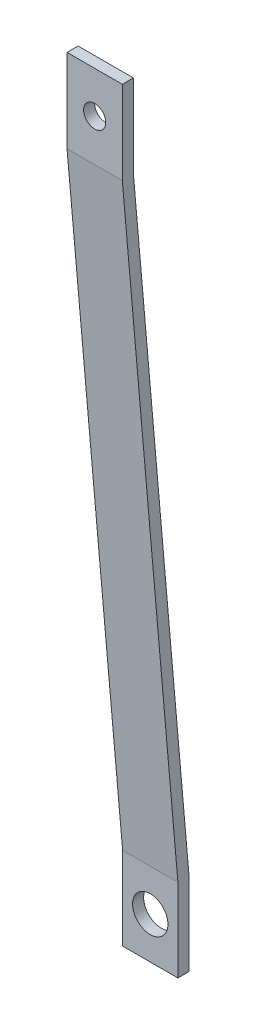
ISO-10303-21;
HEADER;
FILE_DESCRIPTION(('STEP AP214'),'2;1');
FILE_NAME('part.step','',(''),(''),'','','');
FILE_SCHEMA(('AUTOMOTIVE_DESIGN { 1 0 10303 214 1 1 1 1 }'));
ENDSEC;
DATA;
#1=APPLICATION_CONTEXT('core data for automotive mechanical design processes');
#2=APPLICATION_PROTOCOL_DEFINITION('international standard','automotive_design',2000,#1);
#3=PRODUCT_CONTEXT('',#1,'mechanical');
#4=PRODUCT('Part','Part','',(#3));
#5=PRODUCT_RELATED_PRODUCT_CATEGORY('part','',(#4));
#6=PRODUCT_DEFINITION_FORMATION('','',#4);
#7=PRODUCT_DEFINITION_CONTEXT('part definition',#1,'design');
#8=PRODUCT_DEFINITION('design','',#6,#7);
#9=PRODUCT_DEFINITION_SHAPE('','',#8);
#10=(LENGTH_UNIT() NAMED_UNIT(*) SI_UNIT(.MILLI.,.METRE.));
#11=(NAMED_UNIT(*) PLANE_ANGLE_UNIT() SI_UNIT($,.RADIAN.));
#12=(NAMED_UNIT(*) SI_UNIT($,.STERADIAN.) SOLID_ANGLE_UNIT());
#13=UNCERTAINTY_MEASURE_WITH_UNIT(LENGTH_MEASURE(1.E-05),#10,'distance_accuracy_value','');
#14=(GEOMETRIC_REPRESENTATION_CONTEXT(3) GLOBAL_UNCERTAINTY_ASSIGNED_CONTEXT((#13)) GLOBAL_UNIT_ASSIGNED_CONTEXT((#10,
#11,#12)) REPRESENTATION_CONTEXT('',''));
#15=CARTESIAN_POINT('',(0.,0.,0.));
#16=DIRECTION('',(0.,0.,1.));
#17=DIRECTION('',(1.,0.,0.));
#18=AXIS2_PLACEMENT_3D('',#15,#16,#17);
#19=CARTESIAN_POINT('',(10.,0.,2.));
#20=DIRECTION('',(0.,1.,0.));
#21=DIRECTION('',(0.,0.,1.));
#22=AXIS2_PLACEMENT_3D('',#19,#20,#21);
#23=PLANE('',#22);
#24=DIRECTION('',(0.,0.,-1.));
#25=VECTOR('',#24,1.);
#26=CARTESIAN_POINT('',(0.,0.,2.));
#27=LINE('',#26,#25);
#28=CARTESIAN_POINT('',(0.,0.,2.));
#29=VERTEX_POINT('',#28);
#30=CARTESIAN_POINT('',(0.,0.,0.));
#31=VERTEX_POINT('',#30);
#32=EDGE_CURVE('E132',#29,#31,#27,.T.);
#33=ORIENTED_EDGE('',*,*,#32,.T.);
#34=DIRECTION('',(-1.,0.,0.));
#35=VECTOR('',#34,1.);
#36=CARTESIAN_POINT('',(10.,0.,0.));
#37=LINE('',#36,#35);
#38=CARTESIAN_POINT('',(10.,0.,0.));
#39=VERTEX_POINT('',#38);
#40=EDGE_CURVE('E11',#39,#31,#37,.T.);
#41=ORIENTED_EDGE('',*,*,#40,.F.);
#42=DIRECTION('',(0.,0.,-1.));
#43=VECTOR('',#42,1.);
#44=CARTESIAN_POINT('',(10.,0.,2.));
#45=LINE('',#44,#43);
#46=CARTESIAN_POINT('',(10.,0.,2.));
#47=VERTEX_POINT('',#46);
#48=EDGE_CURVE('E147',#47,#39,#45,.T.);
#49=ORIENTED_EDGE('',*,*,#48,.F.);
#50=DIRECTION('',(-1.,0.,0.));
#51=VECTOR('',#50,1.);
#52=CARTESIAN_POINT('',(10.,0.,2.));
#53=LINE('',#52,#51);
#54=EDGE_CURVE('E128',#47,#29,#53,.T.);
#55=ORIENTED_EDGE('',*,*,#54,.T.);
#56=EDGE_LOOP('',(#33,#41,#49,#55));
#57=FACE_BOUND('',#56,.T.);
#58=ADVANCED_FACE('F36',(#57),#23,.F.);
#59=CARTESIAN_POINT('',(10.,15.087321885817,0.));
#60=DIRECTION('',(0.,0.,1.));
#61=DIRECTION('',(0.,-1.,0.));
#62=AXIS2_PLACEMENT_3D('',#59,#60,#61);
#63=PLANE('',#62);
#64=CARTESIAN_POINT('',(5.,7.5,0.));
#65=DIRECTION('',(0.,0.,1.));
#66=DIRECTION('',(0.,-1.,0.));
#67=AXIS2_PLACEMENT_3D('',#64,#65,#66);
#68=CIRCLE('',#67,3.2);
#69=CARTESIAN_POINT('',(5.,4.3,0.));
#70=VERTEX_POINT('',#69);
#71=EDGE_CURVE('E136',#70,#70,#68,.F.);
#72=ORIENTED_EDGE('',*,*,#71,.F.);
#73=EDGE_LOOP('',(#72));
#74=FACE_BOUND('',#73,.T.);
#75=DIRECTION('',(0.,1.,0.));
#76=VECTOR('',#75,1.);
#77=CARTESIAN_POINT('',(0.,15.087321885817,0.));
#78=LINE('',#77,#76);
#79=CARTESIAN_POINT('',(0.,15.087321885817,0.));
#80=VERTEX_POINT('',#79);
#81=EDGE_CURVE('E135',#31,#80,#78,.T.);
#82=ORIENTED_EDGE('',*,*,#81,.T.);
#83=DIRECTION('',(-1.,0.,0.));
#84=VECTOR('',#83,1.);
#85=CARTESIAN_POINT('',(10.,15.087321885817,0.));
#86=LINE('',#85,#84);
#87=CARTESIAN_POINT('',(10.,15.087321885817,0.));
#88=VERTEX_POINT('',#87);
#89=EDGE_CURVE('E44',#88,#80,#86,.T.);
#90=ORIENTED_EDGE('',*,*,#89,.F.);
#91=DIRECTION('',(0.,1.,0.));
#92=VECTOR('',#91,1.);
#93=CARTESIAN_POINT('',(10.,15.087321885817,0.));
#94=LINE('',#93,#92);
#95=EDGE_CURVE('E95',#39,#88,#94,.T.);
#96=ORIENTED_EDGE('',*,*,#95,.F.);
#97=ORIENTED_EDGE('',*,*,#40,.T.);
#98=EDGE_LOOP('',(#82,#90,#96,#97));
#99=FACE_BOUND('',#98,.T.);
#100=ADVANCED_FACE('F204',(#74,#99),#63,.F.);
#101=CARTESIAN_POINT('',(10.,130.,10.0535566303938));
#102=DIRECTION('',(0.,-0.0871557427476515,0.996194698091746));
#103=DIRECTION('',(0.,-0.996194698091746,-0.0871557427476515));
#104=AXIS2_PLACEMENT_3D('',#101,#102,#103);
#105=PLANE('',#104);
#106=DIRECTION('',(0.,0.996194698091746,0.0871557427476515));
#107=VECTOR('',#106,1.);
#108=CARTESIAN_POINT('',(0.,130.,10.0535566303938));
#109=LINE('',#108,#107);
#110=CARTESIAN_POINT('',(0.,130.,10.0535566303938));
#111=VERTEX_POINT('',#110);
#112=EDGE_CURVE('E138',#80,#111,#109,.T.);
#113=ORIENTED_EDGE('',*,*,#112,.T.);
#114=DIRECTION('',(-1.,0.,0.));
#115=VECTOR('',#114,1.);
#116=CARTESIAN_POINT('',(10.,130.,10.0535566303938));
#117=LINE('',#116,#115);
#118=CARTESIAN_POINT('',(10.,130.,10.0535566303938));
#119=VERTEX_POINT('',#118);
#120=EDGE_CURVE('E154',#119,#111,#117,.T.);
#121=ORIENTED_EDGE('',*,*,#120,.F.);
#122=DIRECTION('',(0.,0.996194698091746,0.0871557427476515));
#123=VECTOR('',#122,1.);
#124=CARTESIAN_POINT('',(10.,130.,10.0535566303938));
#125=LINE('',#124,#123);
#126=EDGE_CURVE('E162',#88,#119,#125,.T.);
#127=ORIENTED_EDGE('',*,*,#126,.F.);
#128=ORIENTED_EDGE('',*,*,#89,.T.);
#129=EDGE_LOOP('',(#113,#121,#127,#128));
#130=FACE_BOUND('',#129,.T.);
#131=ADVANCED_FACE('F160',(#130),#105,.F.);
#132=CARTESIAN_POINT('',(10.,145.,10.0535566303938));
#133=DIRECTION('',(0.,0.,1.));
#134=DIRECTION('',(1.,0.,0.));
#135=AXIS2_PLACEMENT_3D('',#132,#133,#134);
#136=PLANE('',#135);
#137=CARTESIAN_POINT('',(5.,137.5,10.0535566303938));
#138=DIRECTION('',(0.,0.,1.));
#139=DIRECTION('',(1.,0.,0.));
#140=AXIS2_PLACEMENT_3D('',#137,#138,#139);
#141=CIRCLE('',#140,2.);
#142=CARTESIAN_POINT('',(7.,137.5,10.0535566303938));
#143=VERTEX_POINT('',#142);
#144=EDGE_CURVE('E185',#143,#143,#141,.F.);
#145=ORIENTED_EDGE('',*,*,#144,.F.);
#146=EDGE_LOOP('',(#145));
#147=FACE_BOUND('',#146,.T.);
#148=DIRECTION('',(0.,1.,0.));
#149=VECTOR('',#148,1.);
#150=CARTESIAN_POINT('',(0.,145.,10.0535566303938));
#151=LINE('',#150,#149);
#152=CARTESIAN_POINT('',(0.,145.,10.0535566303938));
#153=VERTEX_POINT('',#152);
#154=EDGE_CURVE('E140',#111,#153,#151,.T.);
#155=ORIENTED_EDGE('',*,*,#154,.T.);
#156=DIRECTION('',(-1.,0.,0.));
#157=VECTOR('',#156,1.);
#158=CARTESIAN_POINT('',(10.,145.,10.0535566303938));
#159=LINE('',#158,#157);
#160=CARTESIAN_POINT('',(10.,145.,10.0535566303938));
#161=VERTEX_POINT('',#160);
#162=EDGE_CURVE('E151',#161,#153,#159,.T.);
#163=ORIENTED_EDGE('',*,*,#162,.F.);
#164=DIRECTION('',(0.,1.,0.));
#165=VECTOR('',#164,1.);
#166=CARTESIAN_POINT('',(10.,145.,10.0535566303938));
#167=LINE('',#166,#165);
#168=EDGE_CURVE('E174',#119,#161,#167,.T.);
#169=ORIENTED_EDGE('',*,*,#168,.F.);
#170=ORIENTED_EDGE('',*,*,#120,.T.);
#171=EDGE_LOOP('',(#155,#163,#169,#170));
#172=FACE_BOUND('',#171,.T.);
#173=ADVANCED_FACE('F170',(#147,#172),#136,.F.);
#174=CARTESIAN_POINT('',(10.,145.,12.0535566303938));
#175=DIRECTION('',(0.,-1.,0.));
#176=DIRECTION('',(0.,0.,-1.));
#177=AXIS2_PLACEMENT_3D('',#174,#175,#176);
#178=PLANE('',#177);
#179=DIRECTION('',(0.,0.,1.));
#180=VECTOR('',#179,1.);
#181=CARTESIAN_POINT('',(0.,145.,12.0535566303938));
#182=LINE('',#181,#180);
#183=CARTESIAN_POINT('',(0.,145.,12.0535566303938));
#184=VERTEX_POINT('',#183);
#185=EDGE_CURVE('E142',#153,#184,#182,.T.);
#186=ORIENTED_EDGE('',*,*,#185,.T.);
#187=DIRECTION('',(-1.,0.,0.));
#188=VECTOR('',#187,1.);
#189=CARTESIAN_POINT('',(10.,145.,12.0535566303938));
#190=LINE('',#189,#188);
#191=CARTESIAN_POINT('',(10.,145.,12.0535566303938));
#192=VERTEX_POINT('',#191);
#193=EDGE_CURVE('E123',#192,#184,#190,.T.);
#194=ORIENTED_EDGE('',*,*,#193,.F.);
#195=DIRECTION('',(0.,0.,1.));
#196=VECTOR('',#195,1.);
#197=CARTESIAN_POINT('',(10.,145.,12.0535566303938));
#198=LINE('',#197,#196);
#199=EDGE_CURVE('E114',#161,#192,#198,.T.);
#200=ORIENTED_EDGE('',*,*,#199,.F.);
#201=ORIENTED_EDGE('',*,*,#162,.T.);
#202=EDGE_LOOP('',(#186,#194,#200,#201));
#203=FACE_BOUND('',#202,.T.);
#204=ADVANCED_FACE('F173',(#203),#178,.F.);
#205=CARTESIAN_POINT('',(10.,145.,12.0535566303938));
#206=DIRECTION('',(0.,0.,-1.));
#207=DIRECTION('',(0.,1.,0.));
#208=AXIS2_PLACEMENT_3D('',#205,#206,#207);
#209=PLANE('',#208);
#210=CARTESIAN_POINT('',(5.,137.5,12.0535566303938));
#211=DIRECTION('',(0.,0.,1.));
#212=DIRECTION('',(1.,0.,0.));
#213=AXIS2_PLACEMENT_3D('',#210,#211,#212);
#214=CIRCLE('',#213,2.);
#215=CARTESIAN_POINT('',(7.,137.5,12.0535566303938));
#216=VERTEX_POINT('',#215);
#217=EDGE_CURVE('E188',#216,#216,#214,.T.);
#218=ORIENTED_EDGE('',*,*,#217,.F.);
#219=EDGE_LOOP('',(#218));
#220=FACE_BOUND('',#219,.T.);
#221=DIRECTION('',(0.,-1.,0.));
#222=VECTOR('',#221,1.);
#223=CARTESIAN_POINT('',(0.,145.,12.0535566303938));
#224=LINE('',#223,#222);
#225=CARTESIAN_POINT('',(0.,129.912678114183,12.0535566303938));
#226=VERTEX_POINT('',#225);
#227=EDGE_CURVE('E122',#184,#226,#224,.T.);
#228=ORIENTED_EDGE('',*,*,#227,.T.);
#229=DIRECTION('',(-1.,0.,0.));
#230=VECTOR('',#229,1.);
#231=CARTESIAN_POINT('',(10.,129.912678114183,12.0535566303938));
#232=LINE('',#231,#230);
#233=CARTESIAN_POINT('',(10.,129.912678114183,12.0535566303938));
#234=VERTEX_POINT('',#233);
#235=EDGE_CURVE('E119',#234,#226,#232,.T.);
#236=ORIENTED_EDGE('',*,*,#235,.F.);
#237=DIRECTION('',(0.,-1.,0.));
#238=VECTOR('',#237,1.);
#239=CARTESIAN_POINT('',(10.,145.,12.0535566303938));
#240=LINE('',#239,#238);
#241=EDGE_CURVE('E108',#192,#234,#240,.T.);
#242=ORIENTED_EDGE('',*,*,#241,.F.);
#243=ORIENTED_EDGE('',*,*,#193,.T.);
#244=EDGE_LOOP('',(#228,#236,#242,#243));
#245=FACE_BOUND('',#244,.T.);
#246=ADVANCED_FACE('F120',(#220,#245),#209,.F.);
#247=CARTESIAN_POINT('',(10.,129.912678114183,12.0535566303938));
#248=DIRECTION('',(0.,0.0871557427476515,-0.996194698091746));
#249=DIRECTION('',(0.,0.996194698091746,0.0871557427476515));
#250=AXIS2_PLACEMENT_3D('',#247,#248,#249);
#251=PLANE('',#250);
#252=DIRECTION('',(0.,-0.996194698091746,-0.0871557427476515));
#253=VECTOR('',#252,1.);
#254=CARTESIAN_POINT('',(0.,129.912678114183,12.0535566303938));
#255=LINE('',#254,#253);
#256=CARTESIAN_POINT('',(0.,15.,2.));
#257=VERTEX_POINT('',#256);
#258=EDGE_CURVE('E81',#226,#257,#255,.T.);
#259=ORIENTED_EDGE('',*,*,#258,.T.);
#260=DIRECTION('',(-1.,0.,0.));
#261=VECTOR('',#260,1.);
#262=CARTESIAN_POINT('',(10.,15.,2.));
#263=LINE('',#262,#261);
#264=CARTESIAN_POINT('',(10.,15.,2.));
#265=VERTEX_POINT('',#264);
#266=EDGE_CURVE('E124',#265,#257,#263,.T.);
#267=ORIENTED_EDGE('',*,*,#266,.F.);
#268=DIRECTION('',(0.,-0.996194698091746,-0.0871557427476515));
#269=VECTOR('',#268,1.);
#270=CARTESIAN_POINT('',(10.,129.912678114183,12.0535566303938));
#271=LINE('',#270,#269);
#272=EDGE_CURVE('E112',#234,#265,#271,.T.);
#273=ORIENTED_EDGE('',*,*,#272,.F.);
#274=ORIENTED_EDGE('',*,*,#235,.T.);
#275=EDGE_LOOP('',(#259,#267,#273,#274));
#276=FACE_BOUND('',#275,.T.);
#277=ADVANCED_FACE('F126',(#276),#251,.F.);
#278=CARTESIAN_POINT('',(10.,15.,2.));
#279=DIRECTION('',(0.,0.,-1.));
#280=DIRECTION('',(0.,1.,0.));
#281=AXIS2_PLACEMENT_3D('',#278,#279,#280);
#282=PLANE('',#281);
#283=CARTESIAN_POINT('',(5.,7.5,2.));
#284=DIRECTION('',(0.,0.,1.));
#285=DIRECTION('',(1.,0.,0.));
#286=AXIS2_PLACEMENT_3D('',#283,#284,#285);
#287=CIRCLE('',#286,3.2);
#288=CARTESIAN_POINT('',(8.2,7.5,2.));
#289=VERTEX_POINT('',#288);
#290=EDGE_CURVE('E182',#289,#289,#287,.T.);
#291=ORIENTED_EDGE('',*,*,#290,.F.);
#292=EDGE_LOOP('',(#291));
#293=FACE_BOUND('',#292,.T.);
#294=DIRECTION('',(0.,-1.,0.));
#295=VECTOR('',#294,1.);
#296=CARTESIAN_POINT('',(0.,15.,2.));
#297=LINE('',#296,#295);
#298=EDGE_CURVE('E87',#257,#29,#297,.T.);
#299=ORIENTED_EDGE('',*,*,#298,.T.);
#300=ORIENTED_EDGE('',*,*,#54,.F.);
#301=DIRECTION('',(0.,-1.,0.));
#302=VECTOR('',#301,1.);
#303=CARTESIAN_POINT('',(10.,15.,2.));
#304=LINE('',#303,#302);
#305=EDGE_CURVE('E52',#265,#47,#304,.T.);
#306=ORIENTED_EDGE('',*,*,#305,.F.);
#307=ORIENTED_EDGE('',*,*,#266,.T.);
#308=EDGE_LOOP('',(#299,#300,#306,#307));
#309=FACE_BOUND('',#308,.T.);
#310=ADVANCED_FACE('F200',(#293,#309),#282,.F.);
#311=CARTESIAN_POINT('',(10.,0.,0.));
#312=DIRECTION('',(-1.,0.,0.));
#313=DIRECTION('',(0.,0.,1.));
#314=AXIS2_PLACEMENT_3D('',#311,#312,#313);
#315=PLANE('',#314);
#316=ORIENTED_EDGE('',*,*,#48,.T.);
#317=ORIENTED_EDGE('',*,*,#95,.T.);
#318=ORIENTED_EDGE('',*,*,#126,.T.);
#319=ORIENTED_EDGE('',*,*,#168,.T.);
#320=ORIENTED_EDGE('',*,*,#199,.T.);
#321=ORIENTED_EDGE('',*,*,#241,.T.);
#322=ORIENTED_EDGE('',*,*,#272,.T.);
#323=ORIENTED_EDGE('',*,*,#305,.T.);
#324=EDGE_LOOP('',(#316,#317,#318,#319,#320,#321,#322,#323));
#325=FACE_BOUND('',#324,.T.);
#326=ADVANCED_FACE('F110',(#325),#315,.F.);
#327=CARTESIAN_POINT('',(0.,0.,0.));
#328=DIRECTION('',(-1.,0.,0.));
#329=DIRECTION('',(0.,0.,1.));
#330=AXIS2_PLACEMENT_3D('',#327,#328,#329);
#331=PLANE('',#330);
#332=ORIENTED_EDGE('',*,*,#32,.F.);
#333=ORIENTED_EDGE('',*,*,#298,.F.);
#334=ORIENTED_EDGE('',*,*,#258,.F.);
#335=ORIENTED_EDGE('',*,*,#227,.F.);
#336=ORIENTED_EDGE('',*,*,#185,.F.);
#337=ORIENTED_EDGE('',*,*,#154,.F.);
#338=ORIENTED_EDGE('',*,*,#112,.F.);
#339=ORIENTED_EDGE('',*,*,#81,.F.);
#340=EDGE_LOOP('',(#332,#333,#334,#335,#336,#337,#338,#339));
#341=FACE_BOUND('',#340,.T.);
#342=ADVANCED_FACE('F166',(#341),#331,.T.);
#343=CARTESIAN_POINT('',(5.,7.5,-9.05096679918781));
#344=DIRECTION('',(0.,0.,1.));
#345=DIRECTION('',(1.,0.,0.));
#346=AXIS2_PLACEMENT_3D('',#343,#344,#345);
#347=CYLINDRICAL_SURFACE('',#346,3.2);
#348=ORIENTED_EDGE('',*,*,#71,.T.);
#349=EDGE_LOOP('',(#348));
#350=FACE_BOUND('',#349,.T.);
#351=ORIENTED_EDGE('',*,*,#290,.T.);
#352=EDGE_LOOP('',(#351));
#353=FACE_BOUND('',#352,.T.);
#354=ADVANCED_FACE('F222',(#350,#353),#347,.F.);
#355=CARTESIAN_POINT('',(5.,137.5,4.39670238090141));
#356=DIRECTION('',(0.,0.,1.));
#357=DIRECTION('',(1.,0.,0.));
#358=AXIS2_PLACEMENT_3D('',#355,#356,#357);
#359=CYLINDRICAL_SURFACE('',#358,2.);
#360=ORIENTED_EDGE('',*,*,#144,.T.);
#361=EDGE_LOOP('',(#360));
#362=FACE_BOUND('',#361,.T.);
#363=ORIENTED_EDGE('',*,*,#217,.T.);
#364=EDGE_LOOP('',(#363));
#365=FACE_BOUND('',#364,.T.);
#366=ADVANCED_FACE('F192',(#362,#365),#359,.F.);
#367=CLOSED_SHELL('',(#58,#100,#131,#173,#204,#246,#277,#310,#326,#342,#354,#366));
#368=MANIFOLD_SOLID_BREP('B2',#367);
#369=ADVANCED_BREP_SHAPE_REPRESENTATION('',(#18,#368),#14);
#370=SHAPE_DEFINITION_REPRESENTATION(#9,#369);
ENDSEC;
END-ISO-10303-21;
